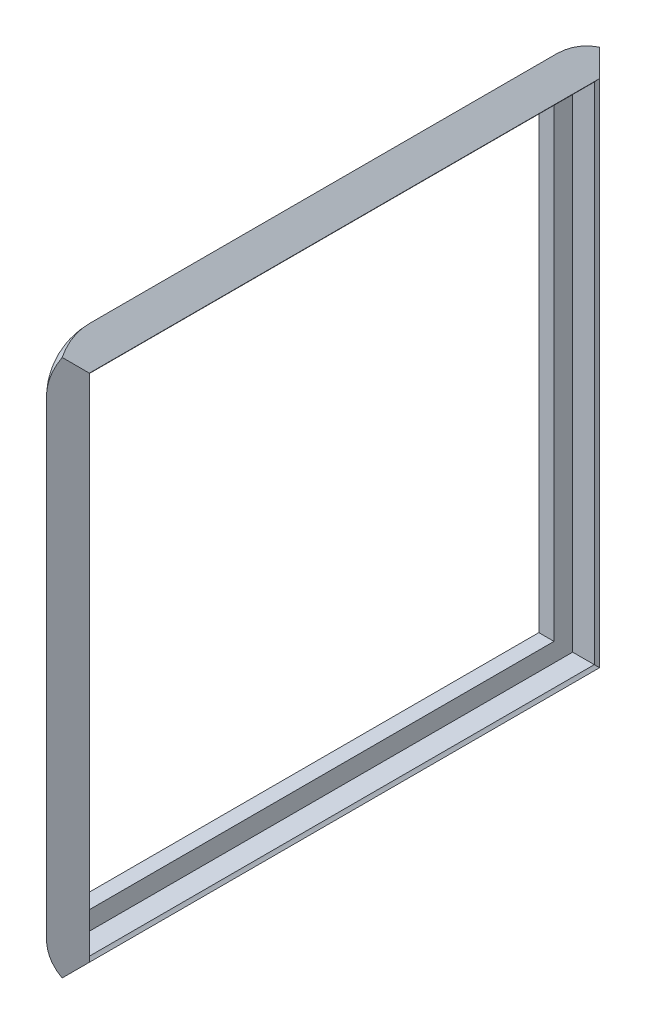
ISO-10303-21;
HEADER;
FILE_DESCRIPTION(('STEP AP214'),'2;1');
FILE_NAME('part.step','',(''),(''),'','','');
FILE_SCHEMA(('AUTOMOTIVE_DESIGN { 1 0 10303 214 1 1 1 1 }'));
ENDSEC;
DATA;
#1=APPLICATION_CONTEXT('core data for automotive mechanical design processes');
#2=APPLICATION_PROTOCOL_DEFINITION('international standard','automotive_design',2000,#1);
#3=PRODUCT_CONTEXT('',#1,'mechanical');
#4=PRODUCT('Part','Part','',(#3));
#5=PRODUCT_RELATED_PRODUCT_CATEGORY('part','',(#4));
#6=PRODUCT_DEFINITION_FORMATION('','',#4);
#7=PRODUCT_DEFINITION_CONTEXT('part definition',#1,'design');
#8=PRODUCT_DEFINITION('design','',#6,#7);
#9=PRODUCT_DEFINITION_SHAPE('','',#8);
#10=(LENGTH_UNIT() NAMED_UNIT(*) SI_UNIT(.MILLI.,.METRE.));
#11=(NAMED_UNIT(*) PLANE_ANGLE_UNIT() SI_UNIT($,.RADIAN.));
#12=(NAMED_UNIT(*) SI_UNIT($,.STERADIAN.) SOLID_ANGLE_UNIT());
#13=UNCERTAINTY_MEASURE_WITH_UNIT(LENGTH_MEASURE(1.E-05),#10,'distance_accuracy_value','');
#14=(GEOMETRIC_REPRESENTATION_CONTEXT(3) GLOBAL_UNCERTAINTY_ASSIGNED_CONTEXT((#13)) GLOBAL_UNIT_ASSIGNED_CONTEXT((#10,
#11,#12)) REPRESENTATION_CONTEXT('',''));
#15=CARTESIAN_POINT('',(0.,0.,0.));
#16=DIRECTION('',(0.,0.,1.));
#17=DIRECTION('',(1.,0.,0.));
#18=AXIS2_PLACEMENT_3D('',#15,#16,#17);
#19=CARTESIAN_POINT('',(0.,0.,91.));
#20=DIRECTION('',(0.,0.,-1.));
#21=DIRECTION('',(-1.,0.,0.));
#22=AXIS2_PLACEMENT_3D('',#19,#20,#21);
#23=CYLINDRICAL_SURFACE('',#22,5.);
#24=CARTESIAN_POINT('',(0.,0.,83.9289321881346));
#25=DIRECTION('',(0.,0.707106781186549,-0.707106781186546));
#26=DIRECTION('',(0.,-0.707106781186546,-0.707106781186548));
#27=AXIS2_PLACEMENT_3D('',#24,#25,#26);
#28=ELLIPSE('',#27,7.07106781186549,5.);
#29=CARTESIAN_POINT('',(-3.53553390593274,3.53553390593274,87.4644660940673));
#30=VERTEX_POINT('',#29);
#31=CARTESIAN_POINT('',(-3.94569924030254,3.07106781186548,87.));
#32=VERTEX_POINT('',#31);
#33=EDGE_CURVE('E230',#30,#32,#28,.F.);
#34=ORIENTED_EDGE('',*,*,#33,.T.);
#35=DIRECTION('',(0.,0.,-1.));
#36=VECTOR('',#35,1.);
#37=CARTESIAN_POINT('',(-3.9456992403025,3.07106781186548,91.));
#38=LINE('',#37,#36);
#39=CARTESIAN_POINT('',(-3.94569924030254,3.07106781186547,4.00000000000003));
#40=VERTEX_POINT('',#39);
#41=EDGE_CURVE('E189',#32,#40,#38,.T.);
#42=ORIENTED_EDGE('',*,*,#41,.T.);
#43=CARTESIAN_POINT('',(0.,0.,7.07106781186546));
#44=DIRECTION('',(0.,-0.707106781186546,-0.707106781186549));
#45=DIRECTION('',(0.,0.707106781186549,-0.707106781186546));
#46=AXIS2_PLACEMENT_3D('',#43,#44,#45);
#47=ELLIPSE('',#46,7.07106781186546,5.);
#48=CARTESIAN_POINT('',(-3.53553390593274,3.53553390593275,3.53553390593274));
#49=VERTEX_POINT('',#48);
#50=EDGE_CURVE('E254',#40,#49,#47,.T.);
#51=ORIENTED_EDGE('',*,*,#50,.T.);
#52=DIRECTION('',(0.,0.,-1.));
#53=VECTOR('',#52,1.);
#54=CARTESIAN_POINT('',(-3.53553390593274,3.53553390593274,91.));
#55=LINE('',#54,#53);
#56=EDGE_CURVE('E245',#30,#49,#55,.T.);
#57=ORIENTED_EDGE('',*,*,#56,.F.);
#58=EDGE_LOOP('',(#34,#42,#51,#57));
#59=FACE_BOUND('',#58,.T.);
#60=ADVANCED_FACE('F37',(#59),#23,.F.);
#61=CARTESIAN_POINT('',(0.,7.07106781186544,83.9289321881346));
#62=DIRECTION('',(0.,-1.,0.));
#63=DIRECTION('',(0.,0.,-1.));
#64=AXIS2_PLACEMENT_3D('',#61,#62,#63);
#65=CYLINDRICAL_SURFACE('',#64,5.);
#66=DIRECTION('',(0.,-1.,0.));
#67=VECTOR('',#66,1.);
#68=CARTESIAN_POINT('',(-3.94569924030254,7.07106781186544,87.));
#69=LINE('',#68,#67);
#70=CARTESIAN_POINT('',(-3.94569924030233,-79.9289321881348,87.));
#71=VERTEX_POINT('',#70);
#72=EDGE_CURVE('E153',#32,#71,#69,.T.);
#73=ORIENTED_EDGE('',*,*,#72,.F.);
#74=ORIENTED_EDGE('',*,*,#33,.F.);
#75=DIRECTION('',(0.,-1.,0.));
#76=VECTOR('',#75,1.);
#77=CARTESIAN_POINT('',(-3.53553390593274,7.07106781186542,87.4644660940673));
#78=LINE('',#77,#76);
#79=CARTESIAN_POINT('',(-3.53553390593274,-80.3933982822018,87.464466094067));
#80=VERTEX_POINT('',#79);
#81=EDGE_CURVE('E225',#30,#80,#78,.T.);
#82=ORIENTED_EDGE('',*,*,#81,.T.);
#83=CARTESIAN_POINT('',(0.,-76.8578643762691,83.9289321881343));
#84=DIRECTION('',(0.,-0.707106781186547,-0.707106781186548));
#85=DIRECTION('',(0.,-0.707106781186549,0.707106781186547));
#86=AXIS2_PLACEMENT_3D('',#83,#84,#85);
#87=ELLIPSE('',#86,7.07106781186547,5.);
#88=EDGE_CURVE('E256',#80,#71,#87,.T.);
#89=ORIENTED_EDGE('',*,*,#88,.T.);
#90=EDGE_LOOP('',(#73,#74,#82,#89));
#91=FACE_BOUND('',#90,.T.);
#92=ADVANCED_FACE('F351',(#91),#65,.F.);
#93=CARTESIAN_POINT('',(0.,0.,91.));
#94=DIRECTION('',(-0.707106781186547,-0.707106781186547,0.));
#95=DIRECTION('',(0.707106781186548,-0.707106781186548,0.));
#96=AXIS2_PLACEMENT_3D('',#93,#94,#95);
#97=PLANE('',#96);
#98=DIRECTION('',(0.577350269189627,-0.577350269189627,0.577350269189625));
#99=VECTOR('',#98,1.);
#100=CARTESIAN_POINT('',(27.9763107293781,-27.9763107293781,35.0473785412435));
#101=LINE('',#100,#99);
#102=CARTESIAN_POINT('',(-5.77350269189628,5.77350269189628,1.2975651199692));
#103=VERTEX_POINT('',#102);
#104=EDGE_CURVE('E200',#103,#49,#101,.T.);
#105=ORIENTED_EDGE('',*,*,#104,.F.);
#106=CARTESIAN_POINT('',(0.,0.,7.07106781186546));
#107=DIRECTION('',(-0.707106781186547,-0.707106781186547,0.));
#108=DIRECTION('',(0.707106781186548,-0.707106781186548,0.));
#109=AXIS2_PLACEMENT_3D('',#106,#107,#108);
#110=CIRCLE('',#109,10.);
#111=CARTESIAN_POINT('',(-7.07106781186548,7.07106781186548,7.07106781186546));
#112=VERTEX_POINT('',#111);
#113=EDGE_CURVE('E280',#103,#112,#110,.F.);
#114=ORIENTED_EDGE('',*,*,#113,.T.);
#115=DIRECTION('',(0.,0.,-1.));
#116=VECTOR('',#115,1.);
#117=CARTESIAN_POINT('',(-7.07106781186548,7.07106781186548,91.));
#118=LINE('',#117,#116);
#119=CARTESIAN_POINT('',(-7.07106781186548,7.07106781186548,83.9289321881346));
#120=VERTEX_POINT('',#119);
#121=EDGE_CURVE('E251',#120,#112,#118,.T.);
#122=ORIENTED_EDGE('',*,*,#121,.F.);
#123=CARTESIAN_POINT('',(0.,0.,83.9289321881346));
#124=DIRECTION('',(-0.707106781186547,-0.707106781186547,0.));
#125=DIRECTION('',(0.707106781186548,-0.707106781186548,0.));
#126=AXIS2_PLACEMENT_3D('',#123,#124,#125);
#127=CIRCLE('',#126,10.);
#128=CARTESIAN_POINT('',(-5.77350269189625,5.77350269189625,89.7024348800308));
#129=VERTEX_POINT('',#128);
#130=EDGE_CURVE('E278',#120,#129,#127,.F.);
#131=ORIENTED_EDGE('',*,*,#130,.T.);
#132=DIRECTION('',(-0.577350269189625,0.577350269189625,0.577350269189627));
#133=VECTOR('',#132,1.);
#134=CARTESIAN_POINT('',(-2.35702260395515,2.35702260395515,86.2859547920897));
#135=LINE('',#134,#133);
#136=EDGE_CURVE('E194',#30,#129,#135,.T.);
#137=ORIENTED_EDGE('',*,*,#136,.F.);
#138=ORIENTED_EDGE('',*,*,#56,.T.);
#139=EDGE_LOOP('',(#105,#114,#122,#131,#137,#138));
#140=FACE_BOUND('',#139,.T.);
#141=ADVANCED_FACE('F357',(#140),#97,.F.);
#142=CARTESIAN_POINT('',(0.,0.,91.));
#143=DIRECTION('',(0.,0.,-1.));
#144=DIRECTION('',(-1.,0.,0.));
#145=AXIS2_PLACEMENT_3D('',#142,#143,#144);
#146=CYLINDRICAL_SURFACE('',#145,10.);
#147=ORIENTED_EDGE('',*,*,#121,.T.);
#148=CARTESIAN_POINT('',(0.,0.,7.07106781186546));
#149=DIRECTION('',(0.,0.,-1.));
#150=DIRECTION('',(-1.,0.,0.));
#151=AXIS2_PLACEMENT_3D('',#148,#149,#150);
#152=CIRCLE('',#151,10.);
#153=CARTESIAN_POINT('',(-10.,0.,7.07106781186547));
#154=VERTEX_POINT('',#153);
#155=EDGE_CURVE('E284',#112,#154,#152,.F.);
#156=ORIENTED_EDGE('',*,*,#155,.T.);
#157=DIRECTION('',(0.,0.,-1.));
#158=VECTOR('',#157,1.);
#159=CARTESIAN_POINT('',(-10.,0.,91.));
#160=LINE('',#159,#158);
#161=CARTESIAN_POINT('',(-10.,0.,83.9289321881346));
#162=VERTEX_POINT('',#161);
#163=EDGE_CURVE('E248',#162,#154,#160,.T.);
#164=ORIENTED_EDGE('',*,*,#163,.F.);
#165=CARTESIAN_POINT('',(0.,0.,83.9289321881346));
#166=DIRECTION('',(0.,0.,-1.));
#167=DIRECTION('',(-1.,0.,0.));
#168=AXIS2_PLACEMENT_3D('',#165,#166,#167);
#169=CIRCLE('',#168,10.);
#170=EDGE_CURVE('E282',#162,#120,#169,.T.);
#171=ORIENTED_EDGE('',*,*,#170,.T.);
#172=EDGE_LOOP('',(#147,#156,#164,#171));
#173=FACE_BOUND('',#172,.T.);
#174=ADVANCED_FACE('F334',(#173),#146,.T.);
#175=CARTESIAN_POINT('',(0.,-76.8578643762691,-2.08166817117217E-13));
#176=DIRECTION('',(-0.707106781186547,0.707106781186547,0.));
#177=DIRECTION('',(-0.707106781186548,-0.707106781186548,0.));
#178=AXIS2_PLACEMENT_3D('',#175,#176,#177);
#179=PLANE('',#178);
#180=DIRECTION('',(0.,0.,1.));
#181=VECTOR('',#180,1.);
#182=CARTESIAN_POINT('',(-7.07106781186548,-83.9289321881346,-2.08166817117217E-13));
#183=LINE('',#182,#181);
#184=CARTESIAN_POINT('',(-7.07106781186548,-83.9289321881346,7.07106781186519));
#185=VERTEX_POINT('',#184);
#186=CARTESIAN_POINT('',(-7.07106781186548,-83.9289321881346,83.9289321881343));
#187=VERTEX_POINT('',#186);
#188=EDGE_CURVE('E209',#185,#187,#183,.T.);
#189=ORIENTED_EDGE('',*,*,#188,.F.);
#190=CARTESIAN_POINT('',(0.,-76.8578643762691,7.07106781186519));
#191=DIRECTION('',(-0.707106781186547,0.707106781186547,0.));
#192=DIRECTION('',(-0.707106781186548,-0.707106781186548,0.));
#193=AXIS2_PLACEMENT_3D('',#190,#191,#192);
#194=CIRCLE('',#193,10.);
#195=CARTESIAN_POINT('',(-5.77350269189625,-82.6313670681654,1.29756511996893));
#196=VERTEX_POINT('',#195);
#197=EDGE_CURVE('E267',#185,#196,#194,.F.);
#198=ORIENTED_EDGE('',*,*,#197,.T.);
#199=DIRECTION('',(0.577350269189625,0.577350269189625,0.577350269189627));
#200=VECTOR('',#199,1.);
#201=CARTESIAN_POINT('',(-2.35702260395514,-79.2148869802243,4.71404520791004));
#202=LINE('',#201,#200);
#203=CARTESIAN_POINT('',(-3.53553390593274,-80.3933982822018,3.53553390593244));
#204=VERTEX_POINT('',#203);
#205=EDGE_CURVE('E197',#196,#204,#202,.T.);
#206=ORIENTED_EDGE('',*,*,#205,.T.);
#207=DIRECTION('',(0.,0.,1.));
#208=VECTOR('',#207,1.);
#209=CARTESIAN_POINT('',(-3.53553390593274,-80.3933982822018,-2.08166817117217E-13));
#210=LINE('',#209,#208);
#211=EDGE_CURVE('E203',#204,#80,#210,.T.);
#212=ORIENTED_EDGE('',*,*,#211,.T.);
#213=DIRECTION('',(0.577350269189626,0.577350269189626,-0.577350269189625));
#214=VECTOR('',#213,1.);
#215=CARTESIAN_POINT('',(27.9763107293781,-48.8815536468909,55.9526214587562));
#216=LINE('',#215,#214);
#217=CARTESIAN_POINT('',(-5.77350269189627,-82.6313670681654,89.7024348800306));
#218=VERTEX_POINT('',#217);
#219=EDGE_CURVE('E192',#218,#80,#216,.T.);
#220=ORIENTED_EDGE('',*,*,#219,.F.);
#221=CARTESIAN_POINT('',(0.,-76.8578643762691,83.9289321881343));
#222=DIRECTION('',(-0.707106781186547,0.707106781186547,0.));
#223=DIRECTION('',(-0.707106781186548,-0.707106781186548,0.));
#224=AXIS2_PLACEMENT_3D('',#221,#222,#223);
#225=CIRCLE('',#224,10.);
#226=EDGE_CURVE('E265',#218,#187,#225,.F.);
#227=ORIENTED_EDGE('',*,*,#226,.T.);
#228=EDGE_LOOP('',(#189,#198,#206,#212,#220,#227));
#229=FACE_BOUND('',#228,.T.);
#230=ADVANCED_FACE('F369',(#229),#179,.F.);
#231=CARTESIAN_POINT('',(0.,-76.8578643762691,-2.08166817117217E-13));
#232=DIRECTION('',(0.,0.,1.));
#233=DIRECTION('',(0.,-1.,0.));
#234=AXIS2_PLACEMENT_3D('',#231,#232,#233);
#235=CYLINDRICAL_SURFACE('',#234,10.);
#236=DIRECTION('',(0.,0.,1.));
#237=VECTOR('',#236,1.);
#238=CARTESIAN_POINT('',(-10.,-76.8578643762691,-2.08166817117217E-13));
#239=LINE('',#238,#237);
#240=CARTESIAN_POINT('',(-10.,-76.8578643762691,7.07106781186518));
#241=VERTEX_POINT('',#240);
#242=CARTESIAN_POINT('',(-10.,-76.8578643762691,83.9289321881343));
#243=VERTEX_POINT('',#242);
#244=EDGE_CURVE('E206',#241,#243,#239,.T.);
#245=ORIENTED_EDGE('',*,*,#244,.F.);
#246=CARTESIAN_POINT('',(0.,-76.8578643762691,7.07106781186519));
#247=DIRECTION('',(0.,0.,1.));
#248=DIRECTION('',(0.,-1.,0.));
#249=AXIS2_PLACEMENT_3D('',#246,#247,#248);
#250=CIRCLE('',#249,10.);
#251=EDGE_CURVE('E262',#241,#185,#250,.T.);
#252=ORIENTED_EDGE('',*,*,#251,.T.);
#253=ORIENTED_EDGE('',*,*,#188,.T.);
#254=CARTESIAN_POINT('',(0.,-76.8578643762691,83.9289321881343));
#255=DIRECTION('',(0.,0.,1.));
#256=DIRECTION('',(0.,-1.,0.));
#257=AXIS2_PLACEMENT_3D('',#254,#255,#256);
#258=CIRCLE('',#257,10.);
#259=EDGE_CURVE('E259',#187,#243,#258,.F.);
#260=ORIENTED_EDGE('',*,*,#259,.T.);
#261=EDGE_LOOP('',(#245,#252,#253,#260));
#262=FACE_BOUND('',#261,.T.);
#263=ADVANCED_FACE('F309',(#262),#235,.T.);
#264=CARTESIAN_POINT('',(0.,-83.9289321881345,7.07106781186517));
#265=DIRECTION('',(0.707106781186547,0.,-0.707106781186547));
#266=DIRECTION('',(-0.707106781186548,0.,-0.707106781186548));
#267=AXIS2_PLACEMENT_3D('',#264,#265,#266);
#268=PLANE('',#267);
#269=ORIENTED_EDGE('',*,*,#205,.F.);
#270=CARTESIAN_POINT('',(0.,-76.8578643762691,7.07106781186519));
#271=DIRECTION('',(0.707106781186547,0.,-0.707106781186547));
#272=DIRECTION('',(-0.707106781186548,0.,-0.707106781186548));
#273=AXIS2_PLACEMENT_3D('',#270,#271,#272);
#274=CIRCLE('',#273,10.);
#275=CARTESIAN_POINT('',(-7.07106781186548,-76.8578643762691,-2.83430315886102E-13));
#276=VERTEX_POINT('',#275);
#277=EDGE_CURVE('E271',#196,#276,#274,.T.);
#278=ORIENTED_EDGE('',*,*,#277,.T.);
#279=DIRECTION('',(0.,1.,0.));
#280=VECTOR('',#279,1.);
#281=CARTESIAN_POINT('',(-7.07106781186548,-83.9289321881345,-3.08551795225043E-13));
#282=LINE('',#281,#280);
#283=CARTESIAN_POINT('',(-7.07106781186548,0.,0.));
#284=VERTEX_POINT('',#283);
#285=EDGE_CURVE('E233',#276,#284,#282,.T.);
#286=ORIENTED_EDGE('',*,*,#285,.T.);
#287=CARTESIAN_POINT('',(0.,0.,7.07106781186546));
#288=DIRECTION('',(0.707106781186547,0.,-0.707106781186547));
#289=DIRECTION('',(-0.707106781186548,0.,-0.707106781186548));
#290=AXIS2_PLACEMENT_3D('',#287,#288,#289);
#291=CIRCLE('',#290,10.);
#292=EDGE_CURVE('E269',#284,#103,#291,.T.);
#293=ORIENTED_EDGE('',*,*,#292,.T.);
#294=ORIENTED_EDGE('',*,*,#104,.T.);
#295=DIRECTION('',(0.,1.,0.));
#296=VECTOR('',#295,1.);
#297=CARTESIAN_POINT('',(-3.53553390593274,-83.9289321881345,3.53553390593243));
#298=LINE('',#297,#296);
#299=EDGE_CURVE('E239',#204,#49,#298,.T.);
#300=ORIENTED_EDGE('',*,*,#299,.F.);
#301=EDGE_LOOP('',(#269,#278,#286,#293,#294,#300));
#302=FACE_BOUND('',#301,.T.);
#303=ADVANCED_FACE('F362',(#302),#268,.T.);
#304=CARTESIAN_POINT('',(0.,-83.9289321881345,7.07106781186517));
#305=DIRECTION('',(0.,1.,0.));
#306=DIRECTION('',(0.,0.,1.));
#307=AXIS2_PLACEMENT_3D('',#304,#305,#306);
#308=CYLINDRICAL_SURFACE('',#307,10.);
#309=ORIENTED_EDGE('',*,*,#285,.F.);
#310=CARTESIAN_POINT('',(0.,-76.8578643762691,7.07106781186519));
#311=DIRECTION('',(0.,1.,0.));
#312=DIRECTION('',(0.,0.,1.));
#313=AXIS2_PLACEMENT_3D('',#310,#311,#312);
#314=CIRCLE('',#313,10.);
#315=EDGE_CURVE('E276',#276,#241,#314,.T.);
#316=ORIENTED_EDGE('',*,*,#315,.T.);
#317=DIRECTION('',(0.,1.,0.));
#318=VECTOR('',#317,1.);
#319=CARTESIAN_POINT('',(-10.,-83.9289321881345,7.07106781186517));
#320=LINE('',#319,#318);
#321=EDGE_CURVE('E236',#241,#154,#320,.T.);
#322=ORIENTED_EDGE('',*,*,#321,.T.);
#323=CARTESIAN_POINT('',(0.,0.,7.07106781186547));
#324=DIRECTION('',(0.,1.,0.));
#325=DIRECTION('',(0.,0.,1.));
#326=AXIS2_PLACEMENT_3D('',#323,#324,#325);
#327=CIRCLE('',#326,10.);
#328=EDGE_CURVE('E273',#154,#284,#327,.F.);
#329=ORIENTED_EDGE('',*,*,#328,.T.);
#330=EDGE_LOOP('',(#309,#316,#322,#329));
#331=FACE_BOUND('',#330,.T.);
#332=ADVANCED_FACE('F411',(#331),#308,.T.);
#333=CARTESIAN_POINT('',(0.,7.07106781186544,83.9289321881346));
#334=DIRECTION('',(0.707106781186547,0.,0.707106781186547));
#335=DIRECTION('',(0.707106781186548,0.,-0.707106781186548));
#336=AXIS2_PLACEMENT_3D('',#333,#334,#335);
#337=PLANE('',#336);
#338=DIRECTION('',(0.,-1.,0.));
#339=VECTOR('',#338,1.);
#340=CARTESIAN_POINT('',(-7.07106781186548,7.07106781186541,91.0000000000001));
#341=LINE('',#340,#339);
#342=CARTESIAN_POINT('',(-7.07106781186548,0.,91.));
#343=VERTEX_POINT('',#342);
#344=CARTESIAN_POINT('',(-7.07106781186548,-76.8578643762691,90.9999999999998));
#345=VERTEX_POINT('',#344);
#346=EDGE_CURVE('E219',#343,#345,#341,.T.);
#347=ORIENTED_EDGE('',*,*,#346,.T.);
#348=CARTESIAN_POINT('',(0.,-76.8578643762691,83.9289321881343));
#349=DIRECTION('',(0.707106781186547,0.,0.707106781186547));
#350=DIRECTION('',(0.707106781186548,0.,-0.707106781186548));
#351=AXIS2_PLACEMENT_3D('',#348,#349,#350);
#352=CIRCLE('',#351,10.);
#353=EDGE_CURVE('E294',#345,#218,#352,.T.);
#354=ORIENTED_EDGE('',*,*,#353,.T.);
#355=ORIENTED_EDGE('',*,*,#219,.T.);
#356=ORIENTED_EDGE('',*,*,#81,.F.);
#357=ORIENTED_EDGE('',*,*,#136,.T.);
#358=CARTESIAN_POINT('',(0.,0.,83.9289321881346));
#359=DIRECTION('',(0.707106781186547,0.,0.707106781186547));
#360=DIRECTION('',(0.707106781186548,0.,-0.707106781186548));
#361=AXIS2_PLACEMENT_3D('',#358,#359,#360);
#362=CIRCLE('',#361,10.);
#363=EDGE_CURVE('E292',#129,#343,#362,.T.);
#364=ORIENTED_EDGE('',*,*,#363,.T.);
#365=EDGE_LOOP('',(#347,#354,#355,#356,#357,#364));
#366=FACE_BOUND('',#365,.T.);
#367=ADVANCED_FACE('F322',(#366),#337,.T.);
#368=CARTESIAN_POINT('',(0.,7.07106781186544,83.9289321881346));
#369=DIRECTION('',(0.,-1.,0.));
#370=DIRECTION('',(0.,0.,-1.));
#371=AXIS2_PLACEMENT_3D('',#368,#369,#370);
#372=CYLINDRICAL_SURFACE('',#371,10.);
#373=DIRECTION('',(0.,-1.,0.));
#374=VECTOR('',#373,1.);
#375=CARTESIAN_POINT('',(-10.,7.07106781186544,83.9289321881346));
#376=LINE('',#375,#374);
#377=EDGE_CURVE('E222',#162,#243,#376,.T.);
#378=ORIENTED_EDGE('',*,*,#377,.T.);
#379=CARTESIAN_POINT('',(0.,-76.8578643762691,83.9289321881343));
#380=DIRECTION('',(0.,-1.,0.));
#381=DIRECTION('',(0.,0.,-1.));
#382=AXIS2_PLACEMENT_3D('',#379,#380,#381);
#383=CIRCLE('',#382,10.);
#384=EDGE_CURVE('E289',#243,#345,#383,.F.);
#385=ORIENTED_EDGE('',*,*,#384,.T.);
#386=ORIENTED_EDGE('',*,*,#346,.F.);
#387=CARTESIAN_POINT('',(0.,0.,83.9289321881346));
#388=DIRECTION('',(0.,-1.,0.));
#389=DIRECTION('',(0.,0.,-1.));
#390=AXIS2_PLACEMENT_3D('',#387,#388,#389);
#391=CIRCLE('',#390,10.);
#392=EDGE_CURVE('E286',#343,#162,#391,.T.);
#393=ORIENTED_EDGE('',*,*,#392,.T.);
#394=EDGE_LOOP('',(#378,#385,#386,#393));
#395=FACE_BOUND('',#394,.T.);
#396=ADVANCED_FACE('F318',(#395),#372,.T.);
#397=CARTESIAN_POINT('',(0.,0.,91.));
#398=DIRECTION('',(0.,1.,0.));
#399=DIRECTION('',(0.,0.,1.));
#400=AXIS2_PLACEMENT_3D('',#397,#398,#399);
#401=PLANE('',#400);
#402=DIRECTION('',(1.,0.,0.));
#403=VECTOR('',#402,1.);
#404=CARTESIAN_POINT('',(0.,0.,7.07106781186546));
#405=LINE('',#404,#403);
#406=CARTESIAN_POINT('',(-7.5,0.,7.07106781186547));
#407=VERTEX_POINT('',#406);
#408=EDGE_CURVE('E242',#154,#407,#405,.T.);
#409=ORIENTED_EDGE('',*,*,#408,.T.);
#410=DIRECTION('',(0.,0.,1.));
#411=VECTOR('',#410,1.);
#412=CARTESIAN_POINT('',(-7.5,0.,91.));
#413=LINE('',#412,#411);
#414=CARTESIAN_POINT('',(-7.5,0.,83.9289321881346));
#415=VERTEX_POINT('',#414);
#416=EDGE_CURVE('E182',#407,#415,#413,.T.);
#417=ORIENTED_EDGE('',*,*,#416,.T.);
#418=DIRECTION('',(-1.,0.,0.));
#419=VECTOR('',#418,1.);
#420=CARTESIAN_POINT('',(0.,0.,83.9289321881346));
#421=LINE('',#420,#419);
#422=EDGE_CURVE('E228',#415,#162,#421,.T.);
#423=ORIENTED_EDGE('',*,*,#422,.T.);
#424=ORIENTED_EDGE('',*,*,#163,.T.);
#425=EDGE_LOOP('',(#409,#417,#423,#424));
#426=FACE_BOUND('',#425,.T.);
#427=ADVANCED_FACE('F338',(#426),#401,.F.);
#428=CARTESIAN_POINT('',(0.,-83.9289321881345,7.07106781186517));
#429=DIRECTION('',(0.,1.,0.));
#430=DIRECTION('',(0.,0.,1.));
#431=AXIS2_PLACEMENT_3D('',#428,#429,#430);
#432=CYLINDRICAL_SURFACE('',#431,5.);
#433=ORIENTED_EDGE('',*,*,#50,.F.);
#434=DIRECTION('',(0.,1.,0.));
#435=VECTOR('',#434,1.);
#436=CARTESIAN_POINT('',(-3.94569924030278,-83.9289321881345,4.00000000000003));
#437=LINE('',#436,#435);
#438=CARTESIAN_POINT('',(-3.94569924030254,-79.9289321881345,4.00000000000003));
#439=VERTEX_POINT('',#438);
#440=EDGE_CURVE('E186',#40,#439,#437,.F.);
#441=ORIENTED_EDGE('',*,*,#440,.T.);
#442=CARTESIAN_POINT('',(0.,-76.8578643762691,7.07106781186519));
#443=DIRECTION('',(0.,0.707106781186549,-0.707106781186546));
#444=DIRECTION('',(0.,0.707106781186546,0.707106781186549));
#445=AXIS2_PLACEMENT_3D('',#442,#443,#444);
#446=ELLIPSE('',#445,7.07106781186549,5.);
#447=EDGE_CURVE('E212',#439,#204,#446,.F.);
#448=ORIENTED_EDGE('',*,*,#447,.T.);
#449=ORIENTED_EDGE('',*,*,#299,.T.);
#450=EDGE_LOOP('',(#433,#441,#448,#449));
#451=FACE_BOUND('',#450,.T.);
#452=ADVANCED_FACE('F366',(#451),#432,.F.);
#453=CARTESIAN_POINT('',(0.,-83.9289321881345,7.07106781186517));
#454=DIRECTION('',(0.,0.,1.));
#455=DIRECTION('',(0.,-1.,0.));
#456=AXIS2_PLACEMENT_3D('',#453,#454,#455);
#457=PLANE('',#456);
#458=DIRECTION('',(0.,-1.,0.));
#459=VECTOR('',#458,1.);
#460=CARTESIAN_POINT('',(-7.5,-83.9289321881345,7.07106781186517));
#461=LINE('',#460,#459);
#462=CARTESIAN_POINT('',(-7.5,-76.8578643762691,7.07106781186519));
#463=VERTEX_POINT('',#462);
#464=EDGE_CURVE('E59',#407,#463,#461,.T.);
#465=ORIENTED_EDGE('',*,*,#464,.F.);
#466=ORIENTED_EDGE('',*,*,#408,.F.);
#467=ORIENTED_EDGE('',*,*,#321,.F.);
#468=DIRECTION('',(1.,0.,0.));
#469=VECTOR('',#468,1.);
#470=CARTESIAN_POINT('',(0.,-76.8578643762691,7.07106781186519));
#471=LINE('',#470,#469);
#472=EDGE_CURVE('E216',#241,#463,#471,.T.);
#473=ORIENTED_EDGE('',*,*,#472,.T.);
#474=EDGE_LOOP('',(#465,#466,#467,#473));
#475=FACE_BOUND('',#474,.T.);
#476=ADVANCED_FACE('F303',(#475),#457,.T.);
#477=CARTESIAN_POINT('',(0.,7.07106781186544,83.9289321881346));
#478=DIRECTION('',(0.,0.,-1.));
#479=DIRECTION('',(0.,1.,0.));
#480=AXIS2_PLACEMENT_3D('',#477,#478,#479);
#481=PLANE('',#480);
#482=DIRECTION('',(0.,1.,0.));
#483=VECTOR('',#482,1.);
#484=CARTESIAN_POINT('',(-7.5,7.07106781186544,83.9289321881346));
#485=LINE('',#484,#483);
#486=CARTESIAN_POINT('',(-7.5,-76.8578643762691,83.9289321881343));
#487=VERTEX_POINT('',#486);
#488=EDGE_CURVE('E176',#487,#415,#485,.T.);
#489=ORIENTED_EDGE('',*,*,#488,.F.);
#490=DIRECTION('',(-1.,0.,0.));
#491=VECTOR('',#490,1.);
#492=CARTESIAN_POINT('',(0.,-76.8578643762691,83.9289321881343));
#493=LINE('',#492,#491);
#494=EDGE_CURVE('E214',#487,#243,#493,.T.);
#495=ORIENTED_EDGE('',*,*,#494,.T.);
#496=ORIENTED_EDGE('',*,*,#377,.F.);
#497=ORIENTED_EDGE('',*,*,#422,.F.);
#498=EDGE_LOOP('',(#489,#495,#496,#497));
#499=FACE_BOUND('',#498,.T.);
#500=ADVANCED_FACE('F332',(#499),#481,.T.);
#501=CARTESIAN_POINT('',(0.,-76.8578643762691,-2.08166817117217E-13));
#502=DIRECTION('',(0.,0.,1.));
#503=DIRECTION('',(0.,-1.,0.));
#504=AXIS2_PLACEMENT_3D('',#501,#502,#503);
#505=CYLINDRICAL_SURFACE('',#504,5.);
#506=DIRECTION('',(0.,0.,1.));
#507=VECTOR('',#506,1.);
#508=CARTESIAN_POINT('',(-3.94569924030254,-79.9289321881345,-2.0765332763003E-13));
#509=LINE('',#508,#507);
#510=EDGE_CURVE('E11',#71,#439,#509,.F.);
#511=ORIENTED_EDGE('',*,*,#510,.F.);
#512=ORIENTED_EDGE('',*,*,#88,.F.);
#513=ORIENTED_EDGE('',*,*,#211,.F.);
#514=ORIENTED_EDGE('',*,*,#447,.F.);
#515=EDGE_LOOP('',(#511,#512,#513,#514));
#516=FACE_BOUND('',#515,.T.);
#517=ADVANCED_FACE('F394',(#516),#505,.F.);
#518=CARTESIAN_POINT('',(0.,-76.8578643762691,-2.08166817117217E-13));
#519=DIRECTION('',(0.,-1.,0.));
#520=DIRECTION('',(0.,0.,-1.));
#521=AXIS2_PLACEMENT_3D('',#518,#519,#520);
#522=PLANE('',#521);
#523=ORIENTED_EDGE('',*,*,#494,.F.);
#524=DIRECTION('',(0.,0.,-1.));
#525=VECTOR('',#524,1.);
#526=CARTESIAN_POINT('',(-7.5,-76.8578643762691,-2.08166817117217E-13));
#527=LINE('',#526,#525);
#528=EDGE_CURVE('E45',#487,#463,#527,.T.);
#529=ORIENTED_EDGE('',*,*,#528,.T.);
#530=ORIENTED_EDGE('',*,*,#472,.F.);
#531=ORIENTED_EDGE('',*,*,#244,.T.);
#532=EDGE_LOOP('',(#523,#529,#530,#531));
#533=FACE_BOUND('',#532,.T.);
#534=ADVANCED_FACE('F298',(#533),#522,.F.);
#535=CARTESIAN_POINT('',(0.,-76.8578643762691,7.07106781186519));
#536=DIRECTION('',(0.,0.,1.));
#537=DIRECTION('',(1.,0.,0.));
#538=AXIS2_PLACEMENT_3D('',#535,#536,#537);
#539=SPHERICAL_SURFACE('',#538,10.);
#540=ORIENTED_EDGE('',*,*,#251,.F.);
#541=ORIENTED_EDGE('',*,*,#315,.F.);
#542=ORIENTED_EDGE('',*,*,#277,.F.);
#543=ORIENTED_EDGE('',*,*,#197,.F.);
#544=EDGE_LOOP('',(#540,#541,#542,#543));
#545=FACE_BOUND('',#544,.T.);
#546=ADVANCED_FACE('F373',(#545),#539,.T.);
#547=CARTESIAN_POINT('',(0.,0.,7.07106781186546));
#548=DIRECTION('',(0.,0.,1.));
#549=DIRECTION('',(1.,0.,0.));
#550=AXIS2_PLACEMENT_3D('',#547,#548,#549);
#551=SPHERICAL_SURFACE('',#550,10.);
#552=ORIENTED_EDGE('',*,*,#328,.F.);
#553=ORIENTED_EDGE('',*,*,#155,.F.);
#554=ORIENTED_EDGE('',*,*,#113,.F.);
#555=ORIENTED_EDGE('',*,*,#292,.F.);
#556=EDGE_LOOP('',(#552,#553,#554,#555));
#557=FACE_BOUND('',#556,.T.);
#558=ADVANCED_FACE('F376',(#557),#551,.T.);
#559=CARTESIAN_POINT('',(0.,-76.8578643762691,83.9289321881343));
#560=DIRECTION('',(0.,0.,1.));
#561=DIRECTION('',(1.,0.,0.));
#562=AXIS2_PLACEMENT_3D('',#559,#560,#561);
#563=SPHERICAL_SURFACE('',#562,10.);
#564=ORIENTED_EDGE('',*,*,#384,.F.);
#565=ORIENTED_EDGE('',*,*,#259,.F.);
#566=ORIENTED_EDGE('',*,*,#226,.F.);
#567=ORIENTED_EDGE('',*,*,#353,.F.);
#568=EDGE_LOOP('',(#564,#565,#566,#567));
#569=FACE_BOUND('',#568,.T.);
#570=ADVANCED_FACE('F314',(#569),#563,.T.);
#571=CARTESIAN_POINT('',(0.,0.,83.9289321881346));
#572=DIRECTION('',(0.,0.,1.));
#573=DIRECTION('',(1.,0.,0.));
#574=AXIS2_PLACEMENT_3D('',#571,#572,#573);
#575=SPHERICAL_SURFACE('',#574,10.);
#576=ORIENTED_EDGE('',*,*,#130,.F.);
#577=ORIENTED_EDGE('',*,*,#170,.F.);
#578=ORIENTED_EDGE('',*,*,#392,.F.);
#579=ORIENTED_EDGE('',*,*,#363,.F.);
#580=EDGE_LOOP('',(#576,#577,#578,#579));
#581=FACE_BOUND('',#580,.T.);
#582=ADVANCED_FACE('F39',(#581),#575,.T.);
#583=CARTESIAN_POINT('',(-3.53553390593274,0.,4.00000000000003));
#584=DIRECTION('',(0.,0.,-1.));
#585=DIRECTION('',(-1.,0.,0.));
#586=AXIS2_PLACEMENT_3D('',#583,#584,#585);
#587=PLANE('',#586);
#588=DIRECTION('',(-1.,0.,0.));
#589=VECTOR('',#588,1.);
#590=CARTESIAN_POINT('',(-3.53553390593274,3.07106781186547,4.00000000000003));
#591=LINE('',#590,#589);
#592=CARTESIAN_POINT('',(-7.5,3.07106781186547,4.00000000000003));
#593=VERTEX_POINT('',#592);
#594=EDGE_CURVE('E177',#40,#593,#591,.T.);
#595=ORIENTED_EDGE('',*,*,#594,.T.);
#596=DIRECTION('',(0.,-1.,0.));
#597=VECTOR('',#596,1.);
#598=CARTESIAN_POINT('',(-7.5,0.,4.00000000000003));
#599=LINE('',#598,#597);
#600=CARTESIAN_POINT('',(-7.5,-79.9289321881345,4.00000000000003));
#601=VERTEX_POINT('',#600);
#602=EDGE_CURVE('E156',#593,#601,#599,.T.);
#603=ORIENTED_EDGE('',*,*,#602,.T.);
#604=DIRECTION('',(-1.,0.,0.));
#605=VECTOR('',#604,1.);
#606=CARTESIAN_POINT('',(-3.53553390593274,-79.9289321881345,4.00000000000003));
#607=LINE('',#606,#605);
#608=EDGE_CURVE('E170',#439,#601,#607,.T.);
#609=ORIENTED_EDGE('',*,*,#608,.F.);
#610=ORIENTED_EDGE('',*,*,#440,.F.);
#611=EDGE_LOOP('',(#595,#603,#609,#610));
#612=FACE_BOUND('',#611,.T.);
#613=ADVANCED_FACE('F347',(#612),#587,.F.);
#614=CARTESIAN_POINT('',(-3.53553390593274,0.,87.));
#615=DIRECTION('',(0.,0.,-1.));
#616=DIRECTION('',(0.,1.,0.));
#617=AXIS2_PLACEMENT_3D('',#614,#615,#616);
#618=PLANE('',#617);
#619=ORIENTED_EDGE('',*,*,#72,.T.);
#620=DIRECTION('',(-1.,0.,0.));
#621=VECTOR('',#620,1.);
#622=CARTESIAN_POINT('',(-3.53553390593274,-79.9289321881345,87.));
#623=LINE('',#622,#621);
#624=CARTESIAN_POINT('',(-7.5,-79.9289321881345,87.));
#625=VERTEX_POINT('',#624);
#626=EDGE_CURVE('E51',#71,#625,#623,.T.);
#627=ORIENTED_EDGE('',*,*,#626,.T.);
#628=DIRECTION('',(0.,-1.,0.));
#629=VECTOR('',#628,1.);
#630=CARTESIAN_POINT('',(-7.5,0.,87.));
#631=LINE('',#630,#629);
#632=CARTESIAN_POINT('',(-7.5,3.07106781186548,87.));
#633=VERTEX_POINT('',#632);
#634=EDGE_CURVE('E151',#633,#625,#631,.T.);
#635=ORIENTED_EDGE('',*,*,#634,.F.);
#636=DIRECTION('',(-1.,0.,0.));
#637=VECTOR('',#636,1.);
#638=CARTESIAN_POINT('',(-3.53553390593274,3.07106781186548,87.));
#639=LINE('',#638,#637);
#640=EDGE_CURVE('E155',#32,#633,#639,.T.);
#641=ORIENTED_EDGE('',*,*,#640,.F.);
#642=EDGE_LOOP('',(#619,#627,#635,#641));
#643=FACE_BOUND('',#642,.T.);
#644=ADVANCED_FACE('F149',(#643),#618,.T.);
#645=CARTESIAN_POINT('',(-7.5,0.,0.));
#646=DIRECTION('',(-1.,0.,0.));
#647=DIRECTION('',(0.,0.,1.));
#648=AXIS2_PLACEMENT_3D('',#645,#646,#647);
#649=PLANE('',#648);
#650=DIRECTION('',(0.,0.,1.));
#651=VECTOR('',#650,1.);
#652=CARTESIAN_POINT('',(-7.5,-79.9289321881345,0.));
#653=LINE('',#652,#651);
#654=EDGE_CURVE('E163',#601,#625,#653,.T.);
#655=ORIENTED_EDGE('',*,*,#654,.F.);
#656=ORIENTED_EDGE('',*,*,#602,.F.);
#657=DIRECTION('',(0.,0.,1.));
#658=VECTOR('',#657,1.);
#659=CARTESIAN_POINT('',(-7.5,3.07106781186547,0.));
#660=LINE('',#659,#658);
#661=EDGE_CURVE('E166',#593,#633,#660,.T.);
#662=ORIENTED_EDGE('',*,*,#661,.T.);
#663=ORIENTED_EDGE('',*,*,#634,.T.);
#664=EDGE_LOOP('',(#655,#656,#662,#663));
#665=FACE_BOUND('',#664,.T.);
#666=ORIENTED_EDGE('',*,*,#464,.T.);
#667=ORIENTED_EDGE('',*,*,#528,.F.);
#668=ORIENTED_EDGE('',*,*,#488,.T.);
#669=ORIENTED_EDGE('',*,*,#416,.F.);
#670=EDGE_LOOP('',(#666,#667,#668,#669));
#671=FACE_BOUND('',#670,.T.);
#672=ADVANCED_FACE('F161',(#665,#671),#649,.F.);
#673=CARTESIAN_POINT('',(-3.53553390593274,-79.9289321881345,0.));
#674=DIRECTION('',(0.,-1.,0.));
#675=DIRECTION('',(0.,0.,-1.));
#676=AXIS2_PLACEMENT_3D('',#673,#674,#675);
#677=PLANE('',#676);
#678=ORIENTED_EDGE('',*,*,#510,.T.);
#679=ORIENTED_EDGE('',*,*,#608,.T.);
#680=ORIENTED_EDGE('',*,*,#654,.T.);
#681=ORIENTED_EDGE('',*,*,#626,.F.);
#682=EDGE_LOOP('',(#678,#679,#680,#681));
#683=FACE_BOUND('',#682,.T.);
#684=ADVANCED_FACE('F168',(#683),#677,.F.);
#685=CARTESIAN_POINT('',(-3.53553390593274,3.07106781186547,0.));
#686=DIRECTION('',(0.,-1.,0.));
#687=DIRECTION('',(0.,0.,-1.));
#688=AXIS2_PLACEMENT_3D('',#685,#686,#687);
#689=PLANE('',#688);
#690=ORIENTED_EDGE('',*,*,#640,.T.);
#691=ORIENTED_EDGE('',*,*,#661,.F.);
#692=ORIENTED_EDGE('',*,*,#594,.F.);
#693=ORIENTED_EDGE('',*,*,#41,.F.);
#694=EDGE_LOOP('',(#690,#691,#692,#693));
#695=FACE_BOUND('',#694,.T.);
#696=ADVANCED_FACE('F345',(#695),#689,.T.);
#697=CLOSED_SHELL('',(#60,#92,#141,#174,#230,#263,#303,#332,#367,#396,#427,#452,#476,#500,#517,
#534,#546,#558,#570,#582,#613,#644,#672,#684,#696));
#698=MANIFOLD_SOLID_BREP('B2',#697);
#699=ADVANCED_BREP_SHAPE_REPRESENTATION('',(#18,#698),#14);
#700=SHAPE_DEFINITION_REPRESENTATION(#9,#699);
ENDSEC;
END-ISO-10303-21;
